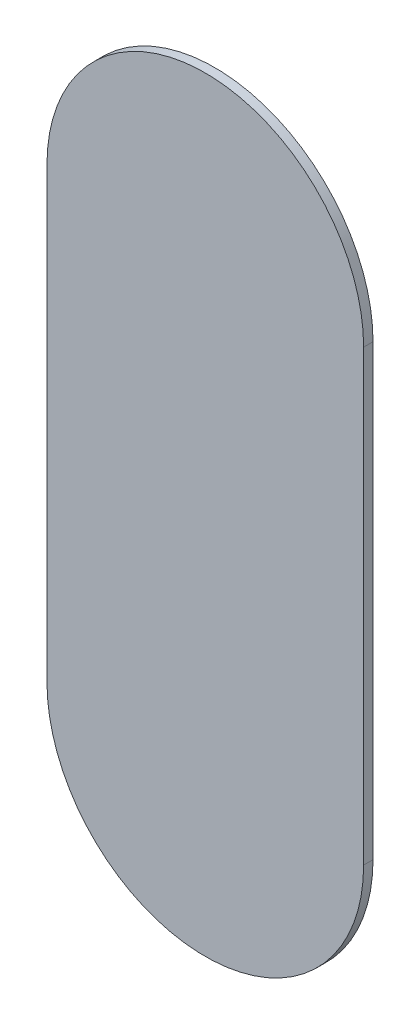
ISO-10303-21;
HEADER;
FILE_DESCRIPTION(('STEP AP214'),'2;1');
FILE_NAME('part.step','',(''),(''),'','','');
FILE_SCHEMA(('AUTOMOTIVE_DESIGN { 1 0 10303 214 1 1 1 1 }'));
ENDSEC;
DATA;
#1=APPLICATION_CONTEXT('core data for automotive mechanical design processes');
#2=APPLICATION_PROTOCOL_DEFINITION('international standard','automotive_design',2000,#1);
#3=PRODUCT_CONTEXT('',#1,'mechanical');
#4=PRODUCT('Part','Part','',(#3));
#5=PRODUCT_RELATED_PRODUCT_CATEGORY('part','',(#4));
#6=PRODUCT_DEFINITION_FORMATION('','',#4);
#7=PRODUCT_DEFINITION_CONTEXT('part definition',#1,'design');
#8=PRODUCT_DEFINITION('design','',#6,#7);
#9=PRODUCT_DEFINITION_SHAPE('','',#8);
#10=(LENGTH_UNIT() NAMED_UNIT(*) SI_UNIT(.MILLI.,.METRE.));
#11=(NAMED_UNIT(*) PLANE_ANGLE_UNIT() SI_UNIT($,.RADIAN.));
#12=(NAMED_UNIT(*) SI_UNIT($,.STERADIAN.) SOLID_ANGLE_UNIT());
#13=UNCERTAINTY_MEASURE_WITH_UNIT(LENGTH_MEASURE(1.E-05),#10,'distance_accuracy_value','');
#14=(GEOMETRIC_REPRESENTATION_CONTEXT(3) GLOBAL_UNCERTAINTY_ASSIGNED_CONTEXT((#13)) GLOBAL_UNIT_ASSIGNED_CONTEXT((#10,
#11,#12)) REPRESENTATION_CONTEXT('',''));
#15=CARTESIAN_POINT('',(0.,0.,0.));
#16=DIRECTION('',(0.,0.,1.));
#17=DIRECTION('',(1.,0.,0.));
#18=AXIS2_PLACEMENT_3D('',#15,#16,#17);
#19=CARTESIAN_POINT('',(86.233,114.5330196,0.));
#20=DIRECTION('',(-1.,0.,0.));
#21=DIRECTION('',(0.,1.,0.));
#22=AXIS2_PLACEMENT_3D('',#19,#20,#21);
#23=PLANE('',#22);
#24=DIRECTION('',(0.,1.,0.));
#25=VECTOR('',#24,1.);
#26=CARTESIAN_POINT('',(86.233,114.5330196,0.03556));
#27=LINE('',#26,#25);
#28=CARTESIAN_POINT('',(86.233,114.5330196,0.03556));
#29=VERTEX_POINT('',#28);
#30=CARTESIAN_POINT('',(86.233,116.2329908,0.03556));
#31=VERTEX_POINT('',#30);
#32=EDGE_CURVE('E11',#29,#31,#27,.T.);
#33=ORIENTED_EDGE('',*,*,#32,.F.);
#34=DIRECTION('',(0.,0.,1.));
#35=VECTOR('',#34,1.);
#36=CARTESIAN_POINT('',(86.233,114.5330196,0.));
#37=LINE('',#36,#35);
#38=CARTESIAN_POINT('',(86.233,114.5330196,0.));
#39=VERTEX_POINT('',#38);
#40=EDGE_CURVE('E24',#39,#29,#37,.T.);
#41=ORIENTED_EDGE('',*,*,#40,.F.);
#42=DIRECTION('',(0.,1.,0.));
#43=VECTOR('',#42,1.);
#44=CARTESIAN_POINT('',(86.233,114.5330196,0.));
#45=LINE('',#44,#43);
#46=CARTESIAN_POINT('',(86.233,116.2329908,0.));
#47=VERTEX_POINT('',#46);
#48=EDGE_CURVE('E75',#39,#47,#45,.T.);
#49=ORIENTED_EDGE('',*,*,#48,.T.);
#50=DIRECTION('',(0.,0.,1.));
#51=VECTOR('',#50,1.);
#52=CARTESIAN_POINT('',(86.233,116.2329908,0.));
#53=LINE('',#52,#51);
#54=EDGE_CURVE('E37',#47,#31,#53,.T.);
#55=ORIENTED_EDGE('',*,*,#54,.T.);
#56=EDGE_LOOP('',(#33,#41,#49,#55));
#57=FACE_BOUND('',#56,.T.);
#58=ADVANCED_FACE('F17',(#57),#23,.F.);
#59=CARTESIAN_POINT('',(85.6330012,116.2329908,0.));
#60=DIRECTION('',(0.,0.,-1.));
#61=DIRECTION('',(1.,0.,0.));
#62=AXIS2_PLACEMENT_3D('',#59,#60,#61);
#63=CYLINDRICAL_SURFACE('',#62,0.599998799999999);
#64=CARTESIAN_POINT('',(85.6330012,116.2329908,0.03556));
#65=DIRECTION('',(0.,0.,1.));
#66=DIRECTION('',(1.,0.,0.));
#67=AXIS2_PLACEMENT_3D('',#64,#65,#66);
#68=CIRCLE('',#67,0.599998799999999);
#69=CARTESIAN_POINT('',(85.0330024,116.2329908,0.03556));
#70=VERTEX_POINT('',#69);
#71=EDGE_CURVE('E83',#31,#70,#68,.T.);
#72=ORIENTED_EDGE('',*,*,#71,.F.);
#73=ORIENTED_EDGE('',*,*,#54,.F.);
#74=CARTESIAN_POINT('',(85.6330012,116.2329908,0.));
#75=DIRECTION('',(0.,0.,1.));
#76=DIRECTION('',(1.,0.,0.));
#77=AXIS2_PLACEMENT_3D('',#74,#75,#76);
#78=CIRCLE('',#77,0.599998799999999);
#79=CARTESIAN_POINT('',(85.0330024,116.2329908,0.));
#80=VERTEX_POINT('',#79);
#81=EDGE_CURVE('E81',#47,#80,#78,.T.);
#82=ORIENTED_EDGE('',*,*,#81,.T.);
#83=DIRECTION('',(0.,0.,1.));
#84=VECTOR('',#83,1.);
#85=CARTESIAN_POINT('',(85.0330024,116.2329908,0.));
#86=LINE('',#85,#84);
#87=EDGE_CURVE('E67',#80,#70,#86,.T.);
#88=ORIENTED_EDGE('',*,*,#87,.T.);
#89=EDGE_LOOP('',(#72,#73,#82,#88));
#90=FACE_BOUND('',#89,.T.);
#91=ADVANCED_FACE('F89',(#90),#63,.T.);
#92=CARTESIAN_POINT('',(85.0330024,116.2329908,0.));
#93=DIRECTION('',(1.,0.,0.));
#94=DIRECTION('',(0.,-1.,0.));
#95=AXIS2_PLACEMENT_3D('',#92,#93,#94);
#96=PLANE('',#95);
#97=DIRECTION('',(0.,-1.,0.));
#98=VECTOR('',#97,1.);
#99=CARTESIAN_POINT('',(85.0330024,116.2329908,0.03556));
#100=LINE('',#99,#98);
#101=CARTESIAN_POINT('',(85.0330024,114.5330196,0.03556));
#102=VERTEX_POINT('',#101);
#103=EDGE_CURVE('E71',#70,#102,#100,.T.);
#104=ORIENTED_EDGE('',*,*,#103,.F.);
#105=ORIENTED_EDGE('',*,*,#87,.F.);
#106=DIRECTION('',(0.,-1.,0.));
#107=VECTOR('',#106,1.);
#108=CARTESIAN_POINT('',(85.0330024,116.2329908,0.));
#109=LINE('',#108,#107);
#110=CARTESIAN_POINT('',(85.0330024,114.5330196,0.));
#111=VERTEX_POINT('',#110);
#112=EDGE_CURVE('E63',#80,#111,#109,.T.);
#113=ORIENTED_EDGE('',*,*,#112,.T.);
#114=DIRECTION('',(0.,0.,1.));
#115=VECTOR('',#114,1.);
#116=CARTESIAN_POINT('',(85.0330024,114.5330196,0.));
#117=LINE('',#116,#115);
#118=EDGE_CURVE('E53',#111,#102,#117,.T.);
#119=ORIENTED_EDGE('',*,*,#118,.T.);
#120=EDGE_LOOP('',(#104,#105,#113,#119));
#121=FACE_BOUND('',#120,.T.);
#122=ADVANCED_FACE('F66',(#121),#96,.F.);
#123=CARTESIAN_POINT('',(85.6330012,114.5330196,0.));
#124=DIRECTION('',(0.,0.,-1.));
#125=DIRECTION('',(-1.,0.,0.));
#126=AXIS2_PLACEMENT_3D('',#123,#124,#125);
#127=CYLINDRICAL_SURFACE('',#126,0.599998800000004);
#128=CARTESIAN_POINT('',(85.6330012,114.5330196,0.03556));
#129=DIRECTION('',(0.,0.,1.));
#130=DIRECTION('',(-1.,0.,0.));
#131=AXIS2_PLACEMENT_3D('',#128,#129,#130);
#132=CIRCLE('',#131,0.599998800000004);
#133=EDGE_CURVE('E59',#102,#29,#132,.T.);
#134=ORIENTED_EDGE('',*,*,#133,.F.);
#135=ORIENTED_EDGE('',*,*,#118,.F.);
#136=CARTESIAN_POINT('',(85.6330012,114.5330196,0.));
#137=DIRECTION('',(0.,0.,1.));
#138=DIRECTION('',(-1.,0.,0.));
#139=AXIS2_PLACEMENT_3D('',#136,#137,#138);
#140=CIRCLE('',#139,0.599998800000004);
#141=EDGE_CURVE('E57',#111,#39,#140,.T.);
#142=ORIENTED_EDGE('',*,*,#141,.T.);
#143=ORIENTED_EDGE('',*,*,#40,.T.);
#144=EDGE_LOOP('',(#134,#135,#142,#143));
#145=FACE_BOUND('',#144,.T.);
#146=ADVANCED_FACE('F55',(#145),#127,.T.);
#147=CARTESIAN_POINT('',(86.233,114.5330196,0.));
#148=DIRECTION('',(0.,0.,-1.));
#149=DIRECTION('',(-1.,0.,0.));
#150=AXIS2_PLACEMENT_3D('',#147,#148,#149);
#151=PLANE('',#150);
#152=ORIENTED_EDGE('',*,*,#141,.F.);
#153=ORIENTED_EDGE('',*,*,#112,.F.);
#154=ORIENTED_EDGE('',*,*,#81,.F.);
#155=ORIENTED_EDGE('',*,*,#48,.F.);
#156=EDGE_LOOP('',(#152,#153,#154,#155));
#157=FACE_BOUND('',#156,.T.);
#158=ADVANCED_FACE('F74',(#157),#151,.T.);
#159=CARTESIAN_POINT('',(86.233,114.5330196,0.03556));
#160=DIRECTION('',(0.,0.,-1.));
#161=DIRECTION('',(-1.,0.,0.));
#162=AXIS2_PLACEMENT_3D('',#159,#160,#161);
#163=PLANE('',#162);
#164=ORIENTED_EDGE('',*,*,#32,.T.);
#165=ORIENTED_EDGE('',*,*,#71,.T.);
#166=ORIENTED_EDGE('',*,*,#103,.T.);
#167=ORIENTED_EDGE('',*,*,#133,.T.);
#168=EDGE_LOOP('',(#164,#165,#166,#167));
#169=FACE_BOUND('',#168,.T.);
#170=ADVANCED_FACE('F91',(#169),#163,.F.);
#171=CLOSED_SHELL('',(#58,#91,#122,#146,#158,#170));
#172=MANIFOLD_SOLID_BREP('B1',#171);
#173=ADVANCED_BREP_SHAPE_REPRESENTATION('',(#18,#172),#14);
#174=SHAPE_DEFINITION_REPRESENTATION(#9,#173);
ENDSEC;
END-ISO-10303-21;
